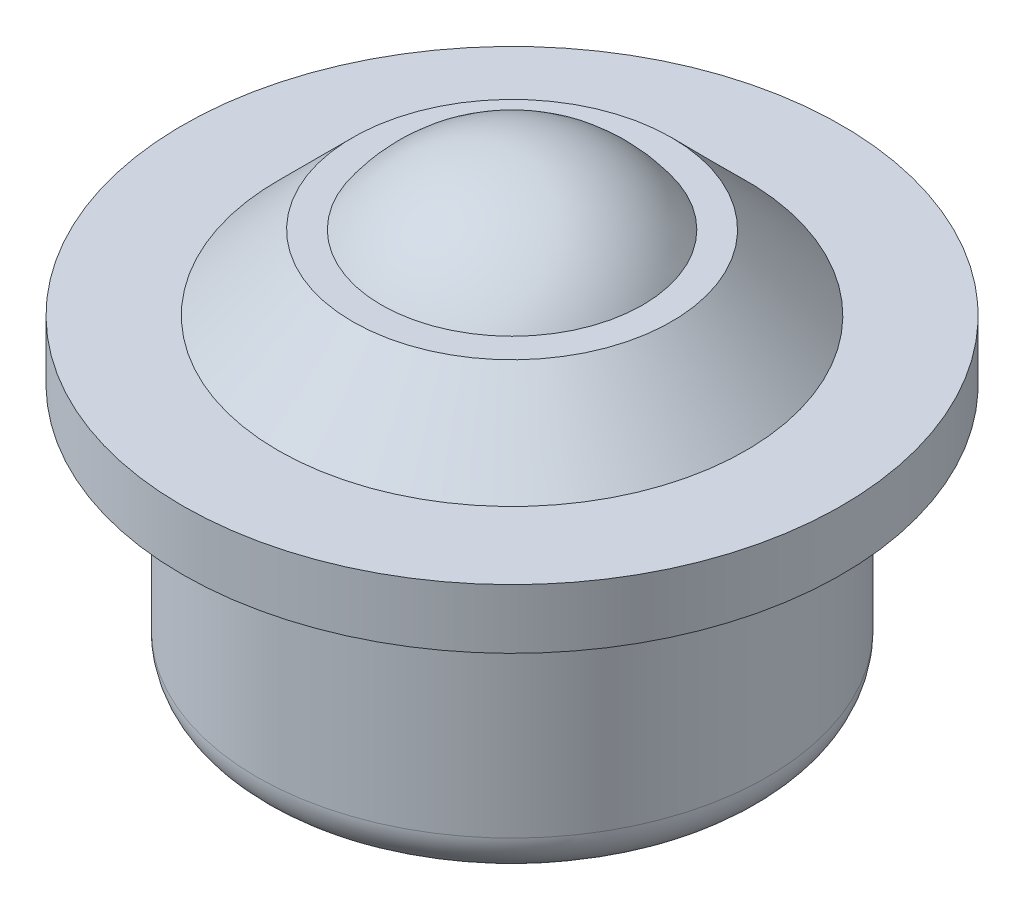
ISO-10303-21;
HEADER;
FILE_DESCRIPTION(('STEP AP214'),'2;1');
FILE_NAME('part.step','',(''),(''),'','','');
FILE_SCHEMA(('AUTOMOTIVE_DESIGN { 1 0 10303 214 1 1 1 1 }'));
ENDSEC;
DATA;
#1=APPLICATION_CONTEXT('core data for automotive mechanical design processes');
#2=APPLICATION_PROTOCOL_DEFINITION('international standard','automotive_design',2000,#1);
#3=PRODUCT_CONTEXT('',#1,'mechanical');
#4=PRODUCT('Part','Part','',(#3));
#5=PRODUCT_RELATED_PRODUCT_CATEGORY('part','',(#4));
#6=PRODUCT_DEFINITION_FORMATION('','',#4);
#7=PRODUCT_DEFINITION_CONTEXT('part definition',#1,'design');
#8=PRODUCT_DEFINITION('design','',#6,#7);
#9=PRODUCT_DEFINITION_SHAPE('','',#8);
#10=(LENGTH_UNIT() NAMED_UNIT(*) SI_UNIT(.MILLI.,.METRE.));
#11=(NAMED_UNIT(*) PLANE_ANGLE_UNIT() SI_UNIT($,.RADIAN.));
#12=(NAMED_UNIT(*) SI_UNIT($,.STERADIAN.) SOLID_ANGLE_UNIT());
#13=UNCERTAINTY_MEASURE_WITH_UNIT(LENGTH_MEASURE(1.E-05),#10,'distance_accuracy_value','');
#14=(GEOMETRIC_REPRESENTATION_CONTEXT(3) GLOBAL_UNCERTAINTY_ASSIGNED_CONTEXT((#13)) GLOBAL_UNIT_ASSIGNED_CONTEXT((#10,
#11,#12)) REPRESENTATION_CONTEXT('',''));
#15=CARTESIAN_POINT('',(0.,0.,0.));
#16=DIRECTION('',(0.,0.,1.));
#17=DIRECTION('',(1.,0.,0.));
#18=AXIS2_PLACEMENT_3D('',#15,#16,#17);
#19=CARTESIAN_POINT('',(0.,-12.,0.));
#20=DIRECTION('',(0.,1.,0.));
#21=DIRECTION('',(0.,0.,1.));
#22=AXIS2_PLACEMENT_3D('',#19,#20,#21);
#23=TOROIDAL_SURFACE('',#22,10.,2.);
#24=CARTESIAN_POINT('',(0.,-13.230532376721,0.));
#25=DIRECTION('',(0.,1.,0.));
#26=DIRECTION('',(0.,0.,1.));
#27=AXIS2_PLACEMENT_3D('',#24,#25,#26);
#28=CIRCLE('',#27,8.42336114793482);
#29=CARTESIAN_POINT('',(0.,-13.230532376721,8.42336114793482));
#30=VERTEX_POINT('',#29);
#31=EDGE_CURVE('E10',#30,#30,#28,.T.);
#32=ORIENTED_EDGE('',*,*,#31,.T.);
#33=EDGE_LOOP('',(#32));
#34=FACE_BOUND('',#33,.T.);
#35=CARTESIAN_POINT('',(0.,-12.,0.));
#36=DIRECTION('',(0.,1.,0.));
#37=DIRECTION('',(0.,0.,1.));
#38=AXIS2_PLACEMENT_3D('',#35,#36,#37);
#39=CIRCLE('',#38,12.);
#40=CARTESIAN_POINT('',(0.,-12.,12.));
#41=VERTEX_POINT('',#40);
#42=EDGE_CURVE('E63',#41,#41,#39,.T.);
#43=ORIENTED_EDGE('',*,*,#42,.F.);
#44=EDGE_LOOP('',(#43));
#45=FACE_BOUND('',#44,.T.);
#46=ADVANCED_FACE('F32',(#34,#45),#23,.T.);
#47=CARTESIAN_POINT('',(0.,-14.461064753442,0.));
#48=DIRECTION('',(0.,1.,0.));
#49=DIRECTION('',(0.,0.,1.));
#50=AXIS2_PLACEMENT_3D('',#47,#48,#49);
#51=TOROIDAL_SURFACE('',#50,6.84672229586964,2.);
#52=CARTESIAN_POINT('',(0.,-12.6534316592617,0.));
#53=DIRECTION('',(0.,1.,0.));
#54=DIRECTION('',(0.,0.,1.));
#55=AXIS2_PLACEMENT_3D('',#52,#53,#54);
#56=CIRCLE('',#55,5.99088200888594);
#57=CARTESIAN_POINT('',(0.,-12.6534316592617,5.99088200888594));
#58=VERTEX_POINT('',#57);
#59=EDGE_CURVE('E38',#58,#58,#56,.T.);
#60=ORIENTED_EDGE('',*,*,#59,.T.);
#61=EDGE_LOOP('',(#60));
#62=FACE_BOUND('',#61,.T.);
#63=ORIENTED_EDGE('',*,*,#31,.F.);
#64=EDGE_LOOP('',(#63));
#65=FACE_BOUND('',#64,.T.);
#66=ADVANCED_FACE('F71',(#62,#65),#51,.F.);
#67=CARTESIAN_POINT('',(0.,0.,0.));
#68=DIRECTION('',(0.,1.,0.));
#69=DIRECTION('',(-1.,0.,0.));
#70=AXIS2_PLACEMENT_3D('',#67,#68,#69);
#71=SPHERICAL_SURFACE('',#70,14.);
#72=ORIENTED_EDGE('',*,*,#59,.F.);
#73=EDGE_LOOP('',(#72));
#74=FACE_BOUND('',#73,.T.);
#75=ADVANCED_FACE('F75',(#74),#71,.T.);
#76=CARTESIAN_POINT('',(0.,0.,0.));
#77=DIRECTION('',(0.,1.,0.));
#78=DIRECTION('',(1.,0.,0.));
#79=AXIS2_PLACEMENT_3D('',#76,#77,#78);
#80=SPHERICAL_SURFACE('',#79,7.5);
#81=CARTESIAN_POINT('',(0.,4.3,0.));
#82=DIRECTION('',(0.,1.,0.));
#83=DIRECTION('',(0.,0.,1.));
#84=AXIS2_PLACEMENT_3D('',#81,#82,#83);
#85=CIRCLE('',#84,6.14491659829489);
#86=CARTESIAN_POINT('',(0.,4.3,6.14491659829489));
#87=VERTEX_POINT('',#86);
#88=EDGE_CURVE('E42',#87,#87,#85,.T.);
#89=ORIENTED_EDGE('',*,*,#88,.T.);
#90=EDGE_LOOP('',(#89));
#91=FACE_BOUND('',#90,.T.);
#92=ADVANCED_FACE('F79',(#91),#80,.T.);
#93=CARTESIAN_POINT('',(-6.14491659829489,4.3,0.));
#94=DIRECTION('',(0.,1.,0.));
#95=DIRECTION('',(0.,0.,1.));
#96=AXIS2_PLACEMENT_3D('',#93,#94,#95);
#97=PLANE('',#96);
#98=CARTESIAN_POINT('',(0.,4.3,0.));
#99=DIRECTION('',(0.,1.,0.));
#100=DIRECTION('',(0.,0.,1.));
#101=AXIS2_PLACEMENT_3D('',#98,#99,#100);
#102=CIRCLE('',#101,7.50000000000001);
#103=CARTESIAN_POINT('',(0.,4.3,7.50000000000001));
#104=VERTEX_POINT('',#103);
#105=EDGE_CURVE('E46',#104,#104,#102,.T.);
#106=ORIENTED_EDGE('',*,*,#105,.T.);
#107=EDGE_LOOP('',(#106));
#108=FACE_BOUND('',#107,.T.);
#109=ORIENTED_EDGE('',*,*,#88,.F.);
#110=EDGE_LOOP('',(#109));
#111=FACE_BOUND('',#110,.T.);
#112=ADVANCED_FACE('F86',(#108,#111),#97,.T.);
#113=CARTESIAN_POINT('',(0.,4.3,0.));
#114=DIRECTION('',(0.,-1.,0.));
#115=DIRECTION('',(0.,0.,-1.));
#116=AXIS2_PLACEMENT_3D('',#113,#114,#115);
#117=CONICAL_SURFACE('',#116,7.50000000000001,0.785398163397446);
#118=CARTESIAN_POINT('',(0.,0.799999999999999,0.));
#119=DIRECTION('',(0.,1.,0.));
#120=DIRECTION('',(0.,0.,1.));
#121=AXIS2_PLACEMENT_3D('',#118,#119,#120);
#122=CIRCLE('',#121,11.);
#123=CARTESIAN_POINT('',(0.,0.799999999999999,11.));
#124=VERTEX_POINT('',#123);
#125=EDGE_CURVE('E51',#124,#124,#122,.T.);
#126=ORIENTED_EDGE('',*,*,#125,.T.);
#127=EDGE_LOOP('',(#126));
#128=FACE_BOUND('',#127,.T.);
#129=ORIENTED_EDGE('',*,*,#105,.F.);
#130=EDGE_LOOP('',(#129));
#131=FACE_BOUND('',#130,.T.);
#132=ADVANCED_FACE('F90',(#128,#131),#117,.T.);
#133=CARTESIAN_POINT('',(-11.,0.799999999999999,0.));
#134=DIRECTION('',(0.,1.,0.));
#135=DIRECTION('',(0.,0.,1.));
#136=AXIS2_PLACEMENT_3D('',#133,#134,#135);
#137=PLANE('',#136);
#138=CARTESIAN_POINT('',(0.,0.799999999999999,0.));
#139=DIRECTION('',(0.,1.,0.));
#140=DIRECTION('',(0.,0.,1.));
#141=AXIS2_PLACEMENT_3D('',#138,#139,#140);
#142=CIRCLE('',#141,15.5);
#143=CARTESIAN_POINT('',(0.,0.799999999999999,15.5));
#144=VERTEX_POINT('',#143);
#145=EDGE_CURVE('E54',#144,#144,#142,.T.);
#146=ORIENTED_EDGE('',*,*,#145,.T.);
#147=EDGE_LOOP('',(#146));
#148=FACE_BOUND('',#147,.T.);
#149=ORIENTED_EDGE('',*,*,#125,.F.);
#150=EDGE_LOOP('',(#149));
#151=FACE_BOUND('',#150,.T.);
#152=ADVANCED_FACE('F94',(#148,#151),#137,.T.);
#153=CARTESIAN_POINT('',(0.,7.5,0.));
#154=DIRECTION('',(0.,1.,0.));
#155=DIRECTION('',(0.,0.,1.));
#156=AXIS2_PLACEMENT_3D('',#153,#154,#155);
#157=CYLINDRICAL_SURFACE('',#156,15.5);
#158=CARTESIAN_POINT('',(0.,-2.,0.));
#159=DIRECTION('',(0.,1.,0.));
#160=DIRECTION('',(0.,0.,1.));
#161=AXIS2_PLACEMENT_3D('',#158,#159,#160);
#162=CIRCLE('',#161,15.5);
#163=CARTESIAN_POINT('',(0.,-2.,15.5));
#164=VERTEX_POINT('',#163);
#165=EDGE_CURVE('E57',#164,#164,#162,.T.);
#166=ORIENTED_EDGE('',*,*,#165,.T.);
#167=EDGE_LOOP('',(#166));
#168=FACE_BOUND('',#167,.T.);
#169=ORIENTED_EDGE('',*,*,#145,.F.);
#170=EDGE_LOOP('',(#169));
#171=FACE_BOUND('',#170,.T.);
#172=ADVANCED_FACE('F98',(#168,#171),#157,.T.);
#173=CARTESIAN_POINT('',(-12.,-2.,0.));
#174=DIRECTION('',(0.,-1.,0.));
#175=DIRECTION('',(0.,0.,-1.));
#176=AXIS2_PLACEMENT_3D('',#173,#174,#175);
#177=PLANE('',#176);
#178=CARTESIAN_POINT('',(0.,-2.,0.));
#179=DIRECTION('',(0.,1.,0.));
#180=DIRECTION('',(0.,0.,1.));
#181=AXIS2_PLACEMENT_3D('',#178,#179,#180);
#182=CIRCLE('',#181,12.);
#183=CARTESIAN_POINT('',(0.,-2.,12.));
#184=VERTEX_POINT('',#183);
#185=EDGE_CURVE('E60',#184,#184,#182,.T.);
#186=ORIENTED_EDGE('',*,*,#185,.T.);
#187=EDGE_LOOP('',(#186));
#188=FACE_BOUND('',#187,.T.);
#189=ORIENTED_EDGE('',*,*,#165,.F.);
#190=EDGE_LOOP('',(#189));
#191=FACE_BOUND('',#190,.T.);
#192=ADVANCED_FACE('F102',(#188,#191),#177,.T.);
#193=CARTESIAN_POINT('',(0.,7.5,0.));
#194=DIRECTION('',(0.,1.,0.));
#195=DIRECTION('',(0.,0.,1.));
#196=AXIS2_PLACEMENT_3D('',#193,#194,#195);
#197=CYLINDRICAL_SURFACE('',#196,12.);
#198=ORIENTED_EDGE('',*,*,#42,.T.);
#199=EDGE_LOOP('',(#198));
#200=FACE_BOUND('',#199,.T.);
#201=ORIENTED_EDGE('',*,*,#185,.F.);
#202=EDGE_LOOP('',(#201));
#203=FACE_BOUND('',#202,.T.);
#204=ADVANCED_FACE('F67',(#200,#203),#197,.T.);
#205=CLOSED_SHELL('',(#46,#66,#75,#92,#112,#132,#152,#172,#192,#204));
#206=MANIFOLD_SOLID_BREP('B2',#205);
#207=ADVANCED_BREP_SHAPE_REPRESENTATION('',(#18,#206),#14);
#208=SHAPE_DEFINITION_REPRESENTATION(#9,#207);
ENDSEC;
END-ISO-10303-21;
